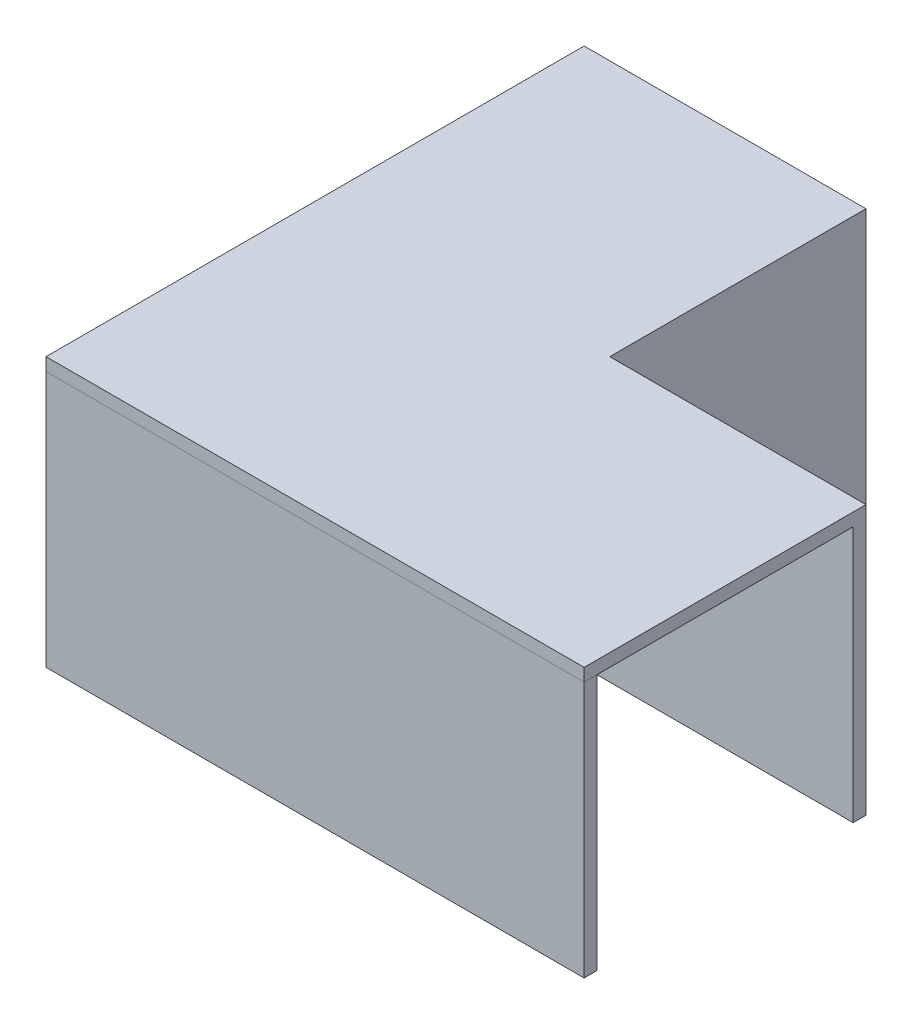
ISO-10303-21;
HEADER;
FILE_DESCRIPTION(('STEP AP214'),'2;1');
FILE_NAME('part.step','',(''),(''),'','','');
FILE_SCHEMA(('AUTOMOTIVE_DESIGN { 1 0 10303 214 1 1 1 1 }'));
ENDSEC;
DATA;
#1=APPLICATION_CONTEXT('core data for automotive mechanical design processes');
#2=APPLICATION_PROTOCOL_DEFINITION('international standard','automotive_design',2000,#1);
#3=PRODUCT_CONTEXT('',#1,'mechanical');
#4=PRODUCT('Part','Part','',(#3));
#5=PRODUCT_RELATED_PRODUCT_CATEGORY('part','',(#4));
#6=PRODUCT_DEFINITION_FORMATION('','',#4);
#7=PRODUCT_DEFINITION_CONTEXT('part definition',#1,'design');
#8=PRODUCT_DEFINITION('design','',#6,#7);
#9=PRODUCT_DEFINITION_SHAPE('','',#8);
#10=(LENGTH_UNIT() NAMED_UNIT(*) SI_UNIT(.MILLI.,.METRE.));
#11=(NAMED_UNIT(*) PLANE_ANGLE_UNIT() SI_UNIT($,.RADIAN.));
#12=(NAMED_UNIT(*) SI_UNIT($,.STERADIAN.) SOLID_ANGLE_UNIT());
#13=UNCERTAINTY_MEASURE_WITH_UNIT(LENGTH_MEASURE(1.E-05),#10,'distance_accuracy_value','');
#14=(GEOMETRIC_REPRESENTATION_CONTEXT(3) GLOBAL_UNCERTAINTY_ASSIGNED_CONTEXT((#13)) GLOBAL_UNIT_ASSIGNED_CONTEXT((#10,
#11,#12)) REPRESENTATION_CONTEXT('',''));
#15=CARTESIAN_POINT('',(0.,0.,0.));
#16=DIRECTION('',(0.,0.,1.));
#17=DIRECTION('',(1.,0.,0.));
#18=AXIS2_PLACEMENT_3D('',#15,#16,#17);
#19=CARTESIAN_POINT('',(0.,254.,0.));
#20=DIRECTION('',(0.,1.,0.));
#21=DIRECTION('',(0.,0.,1.));
#22=AXIS2_PLACEMENT_3D('',#19,#20,#21);
#23=PLANE('',#22);
#24=DIRECTION('',(0.,0.,1.));
#25=VECTOR('',#24,1.);
#26=CARTESIAN_POINT('',(0.,254.,-508.));
#27=LINE('',#26,#25);
#28=CARTESIAN_POINT('',(0.,254.,-520.7));
#29=VERTEX_POINT('',#28);
#30=CARTESIAN_POINT('',(0.,254.,0.));
#31=VERTEX_POINT('',#30);
#32=EDGE_CURVE('E61',#29,#31,#27,.T.);
#33=ORIENTED_EDGE('',*,*,#32,.F.);
#34=DIRECTION('',(-1.,0.,0.));
#35=VECTOR('',#34,1.);
#36=CARTESIAN_POINT('',(266.7,254.,-520.7));
#37=LINE('',#36,#35);
#38=CARTESIAN_POINT('',(-12.7,254.,-520.7));
#39=VERTEX_POINT('',#38);
#40=EDGE_CURVE('E123',#29,#39,#37,.T.);
#41=ORIENTED_EDGE('',*,*,#40,.T.);
#42=DIRECTION('',(0.,0.,1.));
#43=VECTOR('',#42,1.);
#44=CARTESIAN_POINT('',(-12.7,254.,-520.7));
#45=LINE('',#44,#43);
#46=CARTESIAN_POINT('',(-12.6999999999999,254.,12.7));
#47=VERTEX_POINT('',#46);
#48=EDGE_CURVE('E110',#39,#47,#45,.T.);
#49=ORIENTED_EDGE('',*,*,#48,.T.);
#50=DIRECTION('',(1.,0.,0.));
#51=VECTOR('',#50,1.);
#52=CARTESIAN_POINT('',(-12.6999999999999,254.,12.7));
#53=LINE('',#52,#51);
#54=CARTESIAN_POINT('',(520.7,254.,12.7));
#55=VERTEX_POINT('',#54);
#56=EDGE_CURVE('E119',#47,#55,#53,.T.);
#57=ORIENTED_EDGE('',*,*,#56,.T.);
#58=DIRECTION('',(0.,0.,-1.));
#59=VECTOR('',#58,1.);
#60=CARTESIAN_POINT('',(520.7,254.,12.7));
#61=LINE('',#60,#59);
#62=CARTESIAN_POINT('',(520.7,254.,-4.55191440096314E-13));
#63=VERTEX_POINT('',#62);
#64=EDGE_CURVE('E121',#55,#63,#61,.T.);
#65=ORIENTED_EDGE('',*,*,#64,.T.);
#66=DIRECTION('',(1.,0.,0.));
#67=VECTOR('',#66,1.);
#68=CARTESIAN_POINT('',(0.,254.,0.));
#69=LINE('',#68,#67);
#70=EDGE_CURVE('E12',#31,#63,#69,.T.);
#71=ORIENTED_EDGE('',*,*,#70,.F.);
#72=EDGE_LOOP('',(#33,#41,#49,#57,#65,#71));
#73=FACE_BOUND('',#72,.T.);
#74=ADVANCED_FACE('F45',(#73),#23,.T.);
#75=CARTESIAN_POINT('',(0.,0.,0.));
#76=DIRECTION('',(0.,1.,0.));
#77=DIRECTION('',(0.,0.,1.));
#78=AXIS2_PLACEMENT_3D('',#75,#76,#77);
#79=PLANE('',#78);
#80=DIRECTION('',(-1.,0.,0.));
#81=VECTOR('',#80,1.);
#82=CARTESIAN_POINT('',(266.7,0.,-520.7));
#83=LINE('',#82,#81);
#84=CARTESIAN_POINT('',(0.,0.,-520.7));
#85=VERTEX_POINT('',#84);
#86=CARTESIAN_POINT('',(-12.7,0.,-520.7));
#87=VERTEX_POINT('',#86);
#88=EDGE_CURVE('E95',#85,#87,#83,.T.);
#89=ORIENTED_EDGE('',*,*,#88,.F.);
#90=DIRECTION('',(0.,0.,1.));
#91=VECTOR('',#90,1.);
#92=CARTESIAN_POINT('',(0.,0.,-762.));
#93=LINE('',#92,#91);
#94=CARTESIAN_POINT('',(0.,0.,0.));
#95=VERTEX_POINT('',#94);
#96=EDGE_CURVE('E127',#85,#95,#93,.T.);
#97=ORIENTED_EDGE('',*,*,#96,.T.);
#98=DIRECTION('',(1.,0.,0.));
#99=VECTOR('',#98,1.);
#100=CARTESIAN_POINT('',(0.,0.,0.));
#101=LINE('',#100,#99);
#102=CARTESIAN_POINT('',(520.7,0.,-4.55191440096314E-13));
#103=VERTEX_POINT('',#102);
#104=EDGE_CURVE('E126',#95,#103,#101,.T.);
#105=ORIENTED_EDGE('',*,*,#104,.T.);
#106=DIRECTION('',(0.,0.,-1.));
#107=VECTOR('',#106,1.);
#108=CARTESIAN_POINT('',(520.7,0.,12.7));
#109=LINE('',#108,#107);
#110=CARTESIAN_POINT('',(520.7,0.,12.7));
#111=VERTEX_POINT('',#110);
#112=EDGE_CURVE('E48',#111,#103,#109,.T.);
#113=ORIENTED_EDGE('',*,*,#112,.F.);
#114=DIRECTION('',(1.,0.,0.));
#115=VECTOR('',#114,1.);
#116=CARTESIAN_POINT('',(-12.6999999999999,0.,12.7));
#117=LINE('',#116,#115);
#118=CARTESIAN_POINT('',(-12.6999999999999,0.,12.7));
#119=VERTEX_POINT('',#118);
#120=EDGE_CURVE('E111',#119,#111,#117,.T.);
#121=ORIENTED_EDGE('',*,*,#120,.F.);
#122=DIRECTION('',(0.,0.,1.));
#123=VECTOR('',#122,1.);
#124=CARTESIAN_POINT('',(-12.7,0.,-520.7));
#125=LINE('',#124,#123);
#126=EDGE_CURVE('E104',#87,#119,#125,.T.);
#127=ORIENTED_EDGE('',*,*,#126,.F.);
#128=EDGE_LOOP('',(#89,#97,#105,#113,#121,#127));
#129=FACE_BOUND('',#128,.T.);
#130=ADVANCED_FACE('F113',(#129),#79,.F.);
#131=CARTESIAN_POINT('',(266.7,254.,-520.7));
#132=DIRECTION('',(0.,0.,1.));
#133=DIRECTION('',(1.,0.,0.));
#134=AXIS2_PLACEMENT_3D('',#131,#132,#133);
#135=PLANE('',#134);
#136=ORIENTED_EDGE('',*,*,#40,.F.);
#137=DIRECTION('',(0.,-1.,0.));
#138=VECTOR('',#137,1.);
#139=CARTESIAN_POINT('',(0.,254.,-520.7));
#140=LINE('',#139,#138);
#141=EDGE_CURVE('E101',#29,#85,#140,.T.);
#142=ORIENTED_EDGE('',*,*,#141,.T.);
#143=ORIENTED_EDGE('',*,*,#88,.T.);
#144=DIRECTION('',(0.,-1.,0.));
#145=VECTOR('',#144,1.);
#146=CARTESIAN_POINT('',(-12.7,254.,-520.7));
#147=LINE('',#146,#145);
#148=EDGE_CURVE('E99',#39,#87,#147,.T.);
#149=ORIENTED_EDGE('',*,*,#148,.F.);
#150=EDGE_LOOP('',(#136,#142,#143,#149));
#151=FACE_BOUND('',#150,.T.);
#152=ADVANCED_FACE('F98',(#151),#135,.F.);
#153=CARTESIAN_POINT('',(-12.7,254.,-520.7));
#154=DIRECTION('',(1.,0.,0.));
#155=DIRECTION('',(0.,0.,-1.));
#156=AXIS2_PLACEMENT_3D('',#153,#154,#155);
#157=PLANE('',#156);
#158=ORIENTED_EDGE('',*,*,#126,.T.);
#159=DIRECTION('',(0.,-1.,0.));
#160=VECTOR('',#159,1.);
#161=CARTESIAN_POINT('',(-12.6999999999999,254.,12.7));
#162=LINE('',#161,#160);
#163=EDGE_CURVE('E151',#47,#119,#162,.T.);
#164=ORIENTED_EDGE('',*,*,#163,.F.);
#165=ORIENTED_EDGE('',*,*,#48,.F.);
#166=ORIENTED_EDGE('',*,*,#148,.T.);
#167=EDGE_LOOP('',(#158,#164,#165,#166));
#168=FACE_BOUND('',#167,.T.);
#169=ADVANCED_FACE('F107',(#168),#157,.F.);
#170=CARTESIAN_POINT('',(-12.6999999999999,254.,12.7));
#171=DIRECTION('',(0.,0.,-1.));
#172=DIRECTION('',(-1.,0.,0.));
#173=AXIS2_PLACEMENT_3D('',#170,#171,#172);
#174=PLANE('',#173);
#175=ORIENTED_EDGE('',*,*,#120,.T.);
#176=DIRECTION('',(0.,-1.,0.));
#177=VECTOR('',#176,1.);
#178=CARTESIAN_POINT('',(520.7,254.,12.7));
#179=LINE('',#178,#177);
#180=EDGE_CURVE('E130',#55,#111,#179,.T.);
#181=ORIENTED_EDGE('',*,*,#180,.F.);
#182=ORIENTED_EDGE('',*,*,#56,.F.);
#183=ORIENTED_EDGE('',*,*,#163,.T.);
#184=EDGE_LOOP('',(#175,#181,#182,#183));
#185=FACE_BOUND('',#184,.T.);
#186=ADVANCED_FACE('F155',(#185),#174,.F.);
#187=CARTESIAN_POINT('',(520.7,254.,12.7));
#188=DIRECTION('',(-1.,0.,0.));
#189=DIRECTION('',(0.,0.,1.));
#190=AXIS2_PLACEMENT_3D('',#187,#188,#189);
#191=PLANE('',#190);
#192=ORIENTED_EDGE('',*,*,#112,.T.);
#193=DIRECTION('',(0.,1.,0.));
#194=VECTOR('',#193,1.);
#195=CARTESIAN_POINT('',(520.7,254.,-4.54497550705923E-13));
#196=LINE('',#195,#194);
#197=EDGE_CURVE('E131',#103,#63,#196,.T.);
#198=ORIENTED_EDGE('',*,*,#197,.T.);
#199=ORIENTED_EDGE('',*,*,#64,.F.);
#200=ORIENTED_EDGE('',*,*,#180,.T.);
#201=EDGE_LOOP('',(#192,#198,#199,#200));
#202=FACE_BOUND('',#201,.T.);
#203=ADVANCED_FACE('F143',(#202),#191,.F.);
#204=CARTESIAN_POINT('',(0.,254.,-508.));
#205=DIRECTION('',(1.,0.,0.));
#206=DIRECTION('',(0.,0.,-1.));
#207=AXIS2_PLACEMENT_3D('',#204,#205,#206);
#208=PLANE('',#207);
#209=DIRECTION('',(0.,-1.,0.));
#210=VECTOR('',#209,1.);
#211=CARTESIAN_POINT('',(0.,254.,0.));
#212=LINE('',#211,#210);
#213=EDGE_CURVE('E54',#31,#95,#212,.T.);
#214=ORIENTED_EDGE('',*,*,#213,.T.);
#215=ORIENTED_EDGE('',*,*,#96,.F.);
#216=ORIENTED_EDGE('',*,*,#141,.F.);
#217=ORIENTED_EDGE('',*,*,#32,.T.);
#218=EDGE_LOOP('',(#214,#215,#216,#217));
#219=FACE_BOUND('',#218,.T.);
#220=ADVANCED_FACE('F150',(#219),#208,.T.);
#221=CARTESIAN_POINT('',(0.,254.,0.));
#222=DIRECTION('',(0.,0.,-1.));
#223=DIRECTION('',(-1.,0.,0.));
#224=AXIS2_PLACEMENT_3D('',#221,#222,#223);
#225=PLANE('',#224);
#226=ORIENTED_EDGE('',*,*,#104,.F.);
#227=ORIENTED_EDGE('',*,*,#213,.F.);
#228=ORIENTED_EDGE('',*,*,#70,.T.);
#229=ORIENTED_EDGE('',*,*,#197,.F.);
#230=EDGE_LOOP('',(#226,#227,#228,#229));
#231=FACE_BOUND('',#230,.T.);
#232=ADVANCED_FACE('F147',(#231),#225,.T.);
#233=CLOSED_SHELL('',(#74,#130,#152,#169,#186,#203,#220,#232));
#234=MANIFOLD_SOLID_BREP('B2',#233);
#235=CARTESIAN_POINT('',(520.7,254.,12.7));
#236=DIRECTION('',(-1.,0.,0.));
#237=DIRECTION('',(0.,0.,1.));
#238=AXIS2_PLACEMENT_3D('',#235,#236,#237);
#239=PLANE('',#238);
#240=DIRECTION('',(0.,-1.,0.));
#241=VECTOR('',#240,1.);
#242=CARTESIAN_POINT('',(520.7,254.,-266.7));
#243=LINE('',#242,#241);
#244=CARTESIAN_POINT('',(520.7,266.7,-266.7));
#245=VERTEX_POINT('',#244);
#246=CARTESIAN_POINT('',(520.7,0.,-266.7));
#247=VERTEX_POINT('',#246);
#248=EDGE_CURVE('E43',#245,#247,#243,.T.);
#249=ORIENTED_EDGE('',*,*,#248,.F.);
#250=DIRECTION('',(0.,0.,1.));
#251=VECTOR('',#250,1.);
#252=CARTESIAN_POINT('',(520.7,266.7,0.));
#253=LINE('',#252,#251);
#254=CARTESIAN_POINT('',(520.7,266.7,12.7));
#255=VERTEX_POINT('',#254);
#256=EDGE_CURVE('E329',#245,#255,#253,.T.);
#257=ORIENTED_EDGE('',*,*,#256,.T.);
#258=DIRECTION('',(0.,-1.,0.));
#259=VECTOR('',#258,1.);
#260=CARTESIAN_POINT('',(520.7,266.7,12.7));
#261=LINE('',#260,#259);
#262=CARTESIAN_POINT('',(520.7,254.,12.7));
#263=VERTEX_POINT('',#262);
#264=EDGE_CURVE('E335',#255,#263,#261,.T.);
#265=ORIENTED_EDGE('',*,*,#264,.T.);
#266=DIRECTION('',(0.,0.,1.));
#267=VECTOR('',#266,1.);
#268=CARTESIAN_POINT('',(520.7,254.,0.));
#269=LINE('',#268,#267);
#270=CARTESIAN_POINT('',(520.7,254.,-254.));
#271=VERTEX_POINT('',#270);
#272=EDGE_CURVE('E323',#271,#263,#269,.T.);
#273=ORIENTED_EDGE('',*,*,#272,.F.);
#274=DIRECTION('',(0.,-1.,0.));
#275=VECTOR('',#274,1.);
#276=CARTESIAN_POINT('',(520.7,254.,-254.));
#277=LINE('',#276,#275);
#278=CARTESIAN_POINT('',(520.7,0.,-254.));
#279=VERTEX_POINT('',#278);
#280=EDGE_CURVE('E345',#271,#279,#277,.T.);
#281=ORIENTED_EDGE('',*,*,#280,.T.);
#282=DIRECTION('',(0.,0.,-1.));
#283=VECTOR('',#282,1.);
#284=CARTESIAN_POINT('',(520.7,0.,12.7));
#285=LINE('',#284,#283);
#286=EDGE_CURVE('E361',#279,#247,#285,.T.);
#287=ORIENTED_EDGE('',*,*,#286,.T.);
#288=EDGE_LOOP('',(#249,#257,#265,#273,#281,#287));
#289=FACE_BOUND('',#288,.T.);
#290=ADVANCED_FACE('F227',(#289),#239,.F.);
#291=CARTESIAN_POINT('',(520.7,254.,-266.7));
#292=DIRECTION('',(0.,0.,1.));
#293=DIRECTION('',(1.,0.,0.));
#294=AXIS2_PLACEMENT_3D('',#291,#292,#293);
#295=PLANE('',#294);
#296=DIRECTION('',(-1.,0.,0.));
#297=VECTOR('',#296,1.);
#298=CARTESIAN_POINT('',(520.7,0.,-266.7));
#299=LINE('',#298,#297);
#300=CARTESIAN_POINT('',(266.7,0.,-266.7));
#301=VERTEX_POINT('',#300);
#302=EDGE_CURVE('E248',#247,#301,#299,.T.);
#303=ORIENTED_EDGE('',*,*,#302,.T.);
#304=DIRECTION('',(0.,-1.,0.));
#305=VECTOR('',#304,1.);
#306=CARTESIAN_POINT('',(266.7,254.,-266.7));
#307=LINE('',#306,#305);
#308=CARTESIAN_POINT('',(266.7,266.7,-266.7));
#309=VERTEX_POINT('',#308);
#310=EDGE_CURVE('E234',#309,#301,#307,.T.);
#311=ORIENTED_EDGE('',*,*,#310,.F.);
#312=DIRECTION('',(-1.,0.,0.));
#313=VECTOR('',#312,1.);
#314=CARTESIAN_POINT('',(0.,266.7,-266.7));
#315=LINE('',#314,#313);
#316=EDGE_CURVE('E332',#245,#309,#315,.T.);
#317=ORIENTED_EDGE('',*,*,#316,.F.);
#318=ORIENTED_EDGE('',*,*,#248,.T.);
#319=EDGE_LOOP('',(#303,#311,#317,#318));
#320=FACE_BOUND('',#319,.T.);
#321=ADVANCED_FACE('F391',(#320),#295,.F.);
#322=CARTESIAN_POINT('',(266.7,254.,-266.7));
#323=DIRECTION('',(-1.,0.,0.));
#324=DIRECTION('',(0.,0.,1.));
#325=AXIS2_PLACEMENT_3D('',#322,#323,#324);
#326=PLANE('',#325);
#327=DIRECTION('',(0.,0.,-1.));
#328=VECTOR('',#327,1.);
#329=CARTESIAN_POINT('',(266.7,0.,-266.7));
#330=LINE('',#329,#328);
#331=CARTESIAN_POINT('',(266.7,0.,-520.7));
#332=VERTEX_POINT('',#331);
#333=EDGE_CURVE('E241',#301,#332,#330,.T.);
#334=ORIENTED_EDGE('',*,*,#333,.T.);
#335=DIRECTION('',(0.,-1.,0.));
#336=VECTOR('',#335,1.);
#337=CARTESIAN_POINT('',(266.7,254.,-520.7));
#338=LINE('',#337,#336);
#339=CARTESIAN_POINT('',(266.7,266.7,-520.7));
#340=VERTEX_POINT('',#339);
#341=EDGE_CURVE('E367',#340,#332,#338,.T.);
#342=ORIENTED_EDGE('',*,*,#341,.F.);
#343=DIRECTION('',(0.,0.,1.));
#344=VECTOR('',#343,1.);
#345=CARTESIAN_POINT('',(266.7,266.7,0.));
#346=LINE('',#345,#344);
#347=EDGE_CURVE('E322',#340,#309,#346,.T.);
#348=ORIENTED_EDGE('',*,*,#347,.T.);
#349=ORIENTED_EDGE('',*,*,#310,.T.);
#350=EDGE_LOOP('',(#334,#342,#348,#349));
#351=FACE_BOUND('',#350,.T.);
#352=ADVANCED_FACE('F368',(#351),#326,.F.);
#353=CARTESIAN_POINT('',(508.,254.,-254.));
#354=DIRECTION('',(0.,0.,1.));
#355=DIRECTION('',(1.,0.,0.));
#356=AXIS2_PLACEMENT_3D('',#353,#354,#355);
#357=PLANE('',#356);
#358=DIRECTION('',(-1.,0.,0.));
#359=VECTOR('',#358,1.);
#360=CARTESIAN_POINT('',(508.,0.,-254.));
#361=LINE('',#360,#359);
#362=CARTESIAN_POINT('',(254.,0.,-254.));
#363=VERTEX_POINT('',#362);
#364=EDGE_CURVE('E348',#279,#363,#361,.T.);
#365=ORIENTED_EDGE('',*,*,#364,.F.);
#366=ORIENTED_EDGE('',*,*,#280,.F.);
#367=DIRECTION('',(-1.,0.,0.));
#368=VECTOR('',#367,1.);
#369=CARTESIAN_POINT('',(508.,254.,-254.));
#370=LINE('',#369,#368);
#371=CARTESIAN_POINT('',(254.,254.,-254.));
#372=VERTEX_POINT('',#371);
#373=EDGE_CURVE('E349',#271,#372,#370,.T.);
#374=ORIENTED_EDGE('',*,*,#373,.T.);
#375=DIRECTION('',(0.,-1.,0.));
#376=VECTOR('',#375,1.);
#377=CARTESIAN_POINT('',(254.,254.,-254.));
#378=LINE('',#377,#376);
#379=EDGE_CURVE('E356',#372,#363,#378,.T.);
#380=ORIENTED_EDGE('',*,*,#379,.T.);
#381=EDGE_LOOP('',(#365,#366,#374,#380));
#382=FACE_BOUND('',#381,.T.);
#383=ADVANCED_FACE('F384',(#382),#357,.T.);
#384=CARTESIAN_POINT('',(266.7,254.,-520.7));
#385=DIRECTION('',(0.,0.,1.));
#386=DIRECTION('',(1.,0.,0.));
#387=AXIS2_PLACEMENT_3D('',#384,#385,#386);
#388=PLANE('',#387);
#389=DIRECTION('',(-1.,0.,0.));
#390=VECTOR('',#389,1.);
#391=CARTESIAN_POINT('',(266.7,0.,-520.7));
#392=LINE('',#391,#390);
#393=CARTESIAN_POINT('',(254.,0.,-520.7));
#394=VERTEX_POINT('',#393);
#395=EDGE_CURVE('E365',#332,#394,#392,.T.);
#396=ORIENTED_EDGE('',*,*,#395,.T.);
#397=DIRECTION('',(0.,1.,0.));
#398=VECTOR('',#397,1.);
#399=CARTESIAN_POINT('',(254.,254.,-520.7));
#400=LINE('',#399,#398);
#401=CARTESIAN_POINT('',(254.,254.,-520.7));
#402=VERTEX_POINT('',#401);
#403=EDGE_CURVE('E308',#394,#402,#400,.T.);
#404=ORIENTED_EDGE('',*,*,#403,.T.);
#405=DIRECTION('',(1.,0.,0.));
#406=VECTOR('',#405,1.);
#407=CARTESIAN_POINT('',(0.,254.,-520.7));
#408=LINE('',#407,#406);
#409=CARTESIAN_POINT('',(-12.7,254.,-520.7));
#410=VERTEX_POINT('',#409);
#411=EDGE_CURVE('E305',#410,#402,#408,.T.);
#412=ORIENTED_EDGE('',*,*,#411,.F.);
#413=DIRECTION('',(0.,-1.,0.));
#414=VECTOR('',#413,1.);
#415=CARTESIAN_POINT('',(-12.7,266.7,-520.7));
#416=LINE('',#415,#414);
#417=CARTESIAN_POINT('',(-12.7,266.7,-520.7));
#418=VERTEX_POINT('',#417);
#419=EDGE_CURVE('E297',#418,#410,#416,.T.);
#420=ORIENTED_EDGE('',*,*,#419,.F.);
#421=DIRECTION('',(1.,0.,0.));
#422=VECTOR('',#421,1.);
#423=CARTESIAN_POINT('',(0.,266.7,-520.7));
#424=LINE('',#423,#422);
#425=EDGE_CURVE('E302',#418,#340,#424,.T.);
#426=ORIENTED_EDGE('',*,*,#425,.T.);
#427=ORIENTED_EDGE('',*,*,#341,.T.);
#428=EDGE_LOOP('',(#396,#404,#412,#420,#426,#427));
#429=FACE_BOUND('',#428,.T.);
#430=ADVANCED_FACE('F300',(#429),#388,.F.);
#431=CARTESIAN_POINT('',(254.,254.,-254.));
#432=DIRECTION('',(-1.,0.,0.));
#433=DIRECTION('',(0.,0.,1.));
#434=AXIS2_PLACEMENT_3D('',#431,#432,#433);
#435=PLANE('',#434);
#436=DIRECTION('',(0.,0.,-1.));
#437=VECTOR('',#436,1.);
#438=CARTESIAN_POINT('',(254.,0.,-254.));
#439=LINE('',#438,#437);
#440=EDGE_CURVE('E353',#363,#394,#439,.T.);
#441=ORIENTED_EDGE('',*,*,#440,.F.);
#442=ORIENTED_EDGE('',*,*,#379,.F.);
#443=DIRECTION('',(0.,0.,-1.));
#444=VECTOR('',#443,1.);
#445=CARTESIAN_POINT('',(254.,254.,-254.));
#446=LINE('',#445,#444);
#447=EDGE_CURVE('E352',#372,#402,#446,.T.);
#448=ORIENTED_EDGE('',*,*,#447,.T.);
#449=ORIENTED_EDGE('',*,*,#403,.F.);
#450=EDGE_LOOP('',(#441,#442,#448,#449));
#451=FACE_BOUND('',#450,.T.);
#452=ADVANCED_FACE('F377',(#451),#435,.T.);
#453=CARTESIAN_POINT('',(0.,0.,0.));
#454=DIRECTION('',(0.,1.,0.));
#455=DIRECTION('',(0.,0.,1.));
#456=AXIS2_PLACEMENT_3D('',#453,#454,#455);
#457=PLANE('',#456);
#458=ORIENTED_EDGE('',*,*,#440,.T.);
#459=ORIENTED_EDGE('',*,*,#395,.F.);
#460=ORIENTED_EDGE('',*,*,#333,.F.);
#461=ORIENTED_EDGE('',*,*,#302,.F.);
#462=ORIENTED_EDGE('',*,*,#286,.F.);
#463=ORIENTED_EDGE('',*,*,#364,.T.);
#464=EDGE_LOOP('',(#458,#459,#460,#461,#462,#463));
#465=FACE_BOUND('',#464,.T.);
#466=ADVANCED_FACE('F372',(#465),#457,.F.);
#467=CARTESIAN_POINT('',(-12.6999999999999,266.7,0.));
#468=DIRECTION('',(1.,0.,0.));
#469=DIRECTION('',(0.,0.,-1.));
#470=AXIS2_PLACEMENT_3D('',#467,#468,#469);
#471=PLANE('',#470);
#472=DIRECTION('',(0.,0.,1.));
#473=VECTOR('',#472,1.);
#474=CARTESIAN_POINT('',(-12.6999999999999,254.,0.));
#475=LINE('',#474,#473);
#476=CARTESIAN_POINT('',(-12.6999999999999,254.,12.7));
#477=VERTEX_POINT('',#476);
#478=EDGE_CURVE('E337',#410,#477,#475,.T.);
#479=ORIENTED_EDGE('',*,*,#478,.T.);
#480=DIRECTION('',(0.,-1.,0.));
#481=VECTOR('',#480,1.);
#482=CARTESIAN_POINT('',(-12.6999999999999,266.7,12.7));
#483=LINE('',#482,#481);
#484=CARTESIAN_POINT('',(-12.6999999999999,266.7,12.7));
#485=VERTEX_POINT('',#484);
#486=EDGE_CURVE('E309',#485,#477,#483,.T.);
#487=ORIENTED_EDGE('',*,*,#486,.F.);
#488=DIRECTION('',(0.,0.,1.));
#489=VECTOR('',#488,1.);
#490=CARTESIAN_POINT('',(-12.6999999999999,266.7,0.));
#491=LINE('',#490,#489);
#492=EDGE_CURVE('E312',#418,#485,#491,.T.);
#493=ORIENTED_EDGE('',*,*,#492,.F.);
#494=ORIENTED_EDGE('',*,*,#419,.T.);
#495=EDGE_LOOP('',(#479,#487,#493,#494));
#496=FACE_BOUND('',#495,.T.);
#497=ADVANCED_FACE('F313',(#496),#471,.F.);
#498=CARTESIAN_POINT('',(0.,266.7,12.7));
#499=DIRECTION('',(0.,0.,-1.));
#500=DIRECTION('',(-1.,0.,0.));
#501=AXIS2_PLACEMENT_3D('',#498,#499,#500);
#502=PLANE('',#501);
#503=DIRECTION('',(1.,0.,0.));
#504=VECTOR('',#503,1.);
#505=CARTESIAN_POINT('',(0.,254.,12.7));
#506=LINE('',#505,#504);
#507=EDGE_CURVE('E325',#477,#263,#506,.T.);
#508=ORIENTED_EDGE('',*,*,#507,.T.);
#509=ORIENTED_EDGE('',*,*,#264,.F.);
#510=DIRECTION('',(1.,0.,0.));
#511=VECTOR('',#510,1.);
#512=CARTESIAN_POINT('',(0.,266.7,12.7));
#513=LINE('',#512,#511);
#514=EDGE_CURVE('E317',#485,#255,#513,.T.);
#515=ORIENTED_EDGE('',*,*,#514,.F.);
#516=ORIENTED_EDGE('',*,*,#486,.T.);
#517=EDGE_LOOP('',(#508,#509,#515,#516));
#518=FACE_BOUND('',#517,.T.);
#519=ADVANCED_FACE('F389',(#518),#502,.F.);
#520=CARTESIAN_POINT('',(0.,266.7,0.));
#521=DIRECTION('',(0.,1.,0.));
#522=DIRECTION('',(0.,0.,1.));
#523=AXIS2_PLACEMENT_3D('',#520,#521,#522);
#524=PLANE('',#523);
#525=ORIENTED_EDGE('',*,*,#425,.F.);
#526=ORIENTED_EDGE('',*,*,#492,.T.);
#527=ORIENTED_EDGE('',*,*,#514,.T.);
#528=ORIENTED_EDGE('',*,*,#256,.F.);
#529=ORIENTED_EDGE('',*,*,#316,.T.);
#530=ORIENTED_EDGE('',*,*,#347,.F.);
#531=EDGE_LOOP('',(#525,#526,#527,#528,#529,#530));
#532=FACE_BOUND('',#531,.T.);
#533=ADVANCED_FACE('F319',(#532),#524,.T.);
#534=CARTESIAN_POINT('',(0.,254.,0.));
#535=DIRECTION('',(0.,1.,0.));
#536=DIRECTION('',(0.,0.,1.));
#537=AXIS2_PLACEMENT_3D('',#534,#535,#536);
#538=PLANE('',#537);
#539=ORIENTED_EDGE('',*,*,#447,.F.);
#540=ORIENTED_EDGE('',*,*,#373,.F.);
#541=ORIENTED_EDGE('',*,*,#272,.T.);
#542=ORIENTED_EDGE('',*,*,#507,.F.);
#543=ORIENTED_EDGE('',*,*,#478,.F.);
#544=ORIENTED_EDGE('',*,*,#411,.T.);
#545=EDGE_LOOP('',(#539,#540,#541,#542,#543,#544));
#546=FACE_BOUND('',#545,.T.);
#547=ADVANCED_FACE('F380',(#546),#538,.F.);
#548=CLOSED_SHELL('',(#290,#321,#352,#383,#430,#452,#466,#497,#519,#533,#547));
#549=MANIFOLD_SOLID_BREP('B6',#548);
#550=ADVANCED_BREP_SHAPE_REPRESENTATION('',(#18,#234,#549),#14);
#551=SHAPE_DEFINITION_REPRESENTATION(#9,#550);
ENDSEC;
END-ISO-10303-21;
